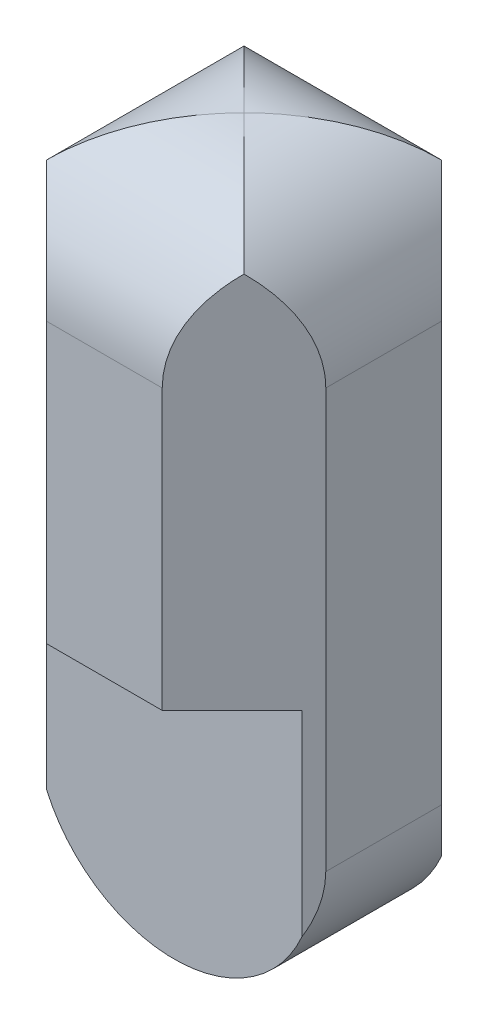
ISO-10303-21;
HEADER;
FILE_DESCRIPTION(('STEP AP214'),'2;1');
FILE_NAME('part.step','',(''),(''),'','','');
FILE_SCHEMA(('AUTOMOTIVE_DESIGN { 1 0 10303 214 1 1 1 1 }'));
ENDSEC;
DATA;
#1=APPLICATION_CONTEXT('core data for automotive mechanical design processes');
#2=APPLICATION_PROTOCOL_DEFINITION('international standard','automotive_design',2000,#1);
#3=PRODUCT_CONTEXT('',#1,'mechanical');
#4=PRODUCT('Part','Part','',(#3));
#5=PRODUCT_RELATED_PRODUCT_CATEGORY('part','',(#4));
#6=PRODUCT_DEFINITION_FORMATION('','',#4);
#7=PRODUCT_DEFINITION_CONTEXT('part definition',#1,'design');
#8=PRODUCT_DEFINITION('design','',#6,#7);
#9=PRODUCT_DEFINITION_SHAPE('','',#8);
#10=(LENGTH_UNIT() NAMED_UNIT(*) SI_UNIT(.MILLI.,.METRE.));
#11=(NAMED_UNIT(*) PLANE_ANGLE_UNIT() SI_UNIT($,.RADIAN.));
#12=(NAMED_UNIT(*) SI_UNIT($,.STERADIAN.) SOLID_ANGLE_UNIT());
#13=UNCERTAINTY_MEASURE_WITH_UNIT(LENGTH_MEASURE(1.E-05),#10,'distance_accuracy_value','');
#14=(GEOMETRIC_REPRESENTATION_CONTEXT(3) GLOBAL_UNCERTAINTY_ASSIGNED_CONTEXT((#13)) GLOBAL_UNIT_ASSIGNED_CONTEXT((#10,
#11,#12)) REPRESENTATION_CONTEXT('',''));
#15=CARTESIAN_POINT('',(0.,0.,0.));
#16=DIRECTION('',(0.,0.,1.));
#17=DIRECTION('',(1.,0.,0.));
#18=AXIS2_PLACEMENT_3D('',#15,#16,#17);
#19=CARTESIAN_POINT('',(4.14213562373094,50.,-10.));
#20=DIRECTION('',(0.,0.,1.));
#21=DIRECTION('',(1.,0.,0.));
#22=AXIS2_PLACEMENT_3D('',#19,#20,#21);
#23=PLANE('',#22);
#24=DIRECTION('',(1.,0.,0.));
#25=VECTOR('',#24,1.);
#26=CARTESIAN_POINT('',(-20.,40.,-9.99999999999999));
#27=LINE('',#26,#25);
#28=CARTESIAN_POINT('',(-4.14213562373095,40.,-10.));
#29=VERTEX_POINT('',#28);
#30=CARTESIAN_POINT('',(4.14213562373095,40.,-10.));
#31=VERTEX_POINT('',#30);
#32=EDGE_CURVE('E138',#29,#31,#27,.T.);
#33=ORIENTED_EDGE('',*,*,#32,.T.);
#34=DIRECTION('',(0.,-1.,0.));
#35=VECTOR('',#34,1.);
#36=CARTESIAN_POINT('',(4.14213562373094,50.,-10.));
#37=LINE('',#36,#35);
#38=CARTESIAN_POINT('',(4.14213562373094,20.,-10.));
#39=VERTEX_POINT('',#38);
#40=EDGE_CURVE('E163',#31,#39,#37,.T.);
#41=ORIENTED_EDGE('',*,*,#40,.T.);
#42=DIRECTION('',(1.,0.,0.));
#43=VECTOR('',#42,1.);
#44=CARTESIAN_POINT('',(10.,20.,-10.));
#45=LINE('',#44,#43);
#46=CARTESIAN_POINT('',(-4.14213562373096,20.,-10.));
#47=VERTEX_POINT('',#46);
#48=EDGE_CURVE('E162',#47,#39,#45,.T.);
#49=ORIENTED_EDGE('',*,*,#48,.F.);
#50=DIRECTION('',(0.,-1.,0.));
#51=VECTOR('',#50,1.);
#52=CARTESIAN_POINT('',(-4.14213562373096,50.,-10.));
#53=LINE('',#52,#51);
#54=EDGE_CURVE('E154',#29,#47,#53,.T.);
#55=ORIENTED_EDGE('',*,*,#54,.F.);
#56=EDGE_LOOP('',(#33,#41,#49,#55));
#57=FACE_BOUND('',#56,.T.);
#58=ADVANCED_FACE('F34',(#57),#23,.F.);
#59=CARTESIAN_POINT('',(0.,40.,-20.));
#60=DIRECTION('',(0.,0.,1.));
#61=DIRECTION('',(1.,0.,0.));
#62=AXIS2_PLACEMENT_3D('',#59,#60,#61);
#63=CYLINDRICAL_SURFACE('',#62,10.);
#64=CARTESIAN_POINT('',(0.,40.,-14.1421356237309));
#65=DIRECTION('',(-0.707106781186547,0.,0.707106781186548));
#66=DIRECTION('',(0.707106781186548,0.,0.707106781186547));
#67=AXIS2_PLACEMENT_3D('',#64,#65,#66);
#68=ELLIPSE('',#67,14.1421356237309,10.);
#69=CARTESIAN_POINT('',(7.07106781186547,47.0710678118655,-7.07106781186548));
#70=VERTEX_POINT('',#69);
#71=CARTESIAN_POINT('',(10.,40.,-4.14213562373095));
#72=VERTEX_POINT('',#71);
#73=EDGE_CURVE('E191',#70,#72,#68,.F.);
#74=ORIENTED_EDGE('',*,*,#73,.F.);
#75=CARTESIAN_POINT('',(0.,40.,0.));
#76=DIRECTION('',(0.707106781186548,0.,0.707106781186547));
#77=DIRECTION('',(-0.707106781186547,0.,0.707106781186548));
#78=AXIS2_PLACEMENT_3D('',#75,#76,#77);
#79=ELLIPSE('',#78,14.142135623731,10.);
#80=CARTESIAN_POINT('',(0.,50.,0.));
#81=VERTEX_POINT('',#80);
#82=EDGE_CURVE('E42',#70,#81,#79,.T.);
#83=ORIENTED_EDGE('',*,*,#82,.T.);
#84=CARTESIAN_POINT('',(0.,40.,0.));
#85=DIRECTION('',(-0.707106781186547,0.,0.707106781186548));
#86=DIRECTION('',(0.707106781186548,0.,0.707106781186547));
#87=AXIS2_PLACEMENT_3D('',#84,#85,#86);
#88=ELLIPSE('',#87,14.1421356237309,10.);
#89=CARTESIAN_POINT('',(7.07106781186548,47.0710678118655,7.07106781186547));
#90=VERTEX_POINT('',#89);
#91=EDGE_CURVE('E182',#81,#90,#88,.F.);
#92=ORIENTED_EDGE('',*,*,#91,.T.);
#93=CARTESIAN_POINT('',(0.,40.,14.1421356237309));
#94=DIRECTION('',(-0.707106781186548,0.,-0.707106781186548));
#95=DIRECTION('',(-0.707106781186548,0.,0.707106781186548));
#96=AXIS2_PLACEMENT_3D('',#93,#94,#95);
#97=ELLIPSE('',#96,14.1421356237309,10.);
#98=CARTESIAN_POINT('',(10.,40.,4.14213562373096));
#99=VERTEX_POINT('',#98);
#100=EDGE_CURVE('E215',#99,#90,#97,.F.);
#101=ORIENTED_EDGE('',*,*,#100,.F.);
#102=DIRECTION('',(0.,0.,1.));
#103=VECTOR('',#102,1.);
#104=CARTESIAN_POINT('',(10.,40.,-20.));
#105=LINE('',#104,#103);
#106=EDGE_CURVE('E206',#72,#99,#105,.T.);
#107=ORIENTED_EDGE('',*,*,#106,.F.);
#108=EDGE_LOOP('',(#74,#83,#92,#101,#107));
#109=FACE_BOUND('',#108,.T.);
#110=ADVANCED_FACE('F188',(#109),#63,.T.);
#111=CARTESIAN_POINT('',(-4.14213562373096,50.,10.));
#112=DIRECTION('',(0.,0.,-1.));
#113=DIRECTION('',(-1.,0.,0.));
#114=AXIS2_PLACEMENT_3D('',#111,#112,#113);
#115=PLANE('',#114);
#116=DIRECTION('',(0.,-1.,0.));
#117=VECTOR('',#116,1.);
#118=CARTESIAN_POINT('',(4.14213562373096,50.,10.));
#119=LINE('',#118,#117);
#120=CARTESIAN_POINT('',(4.14213562373095,40.,9.99999999999999));
#121=VERTEX_POINT('',#120);
#122=CARTESIAN_POINT('',(4.14213562373096,20.,10.));
#123=VERTEX_POINT('',#122);
#124=EDGE_CURVE('E261',#121,#123,#119,.T.);
#125=ORIENTED_EDGE('',*,*,#124,.F.);
#126=DIRECTION('',(1.,0.,0.));
#127=VECTOR('',#126,1.);
#128=CARTESIAN_POINT('',(-20.,40.,10.));
#129=LINE('',#128,#127);
#130=CARTESIAN_POINT('',(-4.14213562373096,40.,10.));
#131=VERTEX_POINT('',#130);
#132=EDGE_CURVE('E148',#131,#121,#129,.T.);
#133=ORIENTED_EDGE('',*,*,#132,.F.);
#134=DIRECTION('',(0.,-1.,0.));
#135=VECTOR('',#134,1.);
#136=CARTESIAN_POINT('',(-4.14213562373096,50.,10.));
#137=LINE('',#136,#135);
#138=CARTESIAN_POINT('',(-4.14213562373096,20.,10.));
#139=VERTEX_POINT('',#138);
#140=EDGE_CURVE('E204',#131,#139,#137,.T.);
#141=ORIENTED_EDGE('',*,*,#140,.T.);
#142=DIRECTION('',(-1.,0.,0.));
#143=VECTOR('',#142,1.);
#144=CARTESIAN_POINT('',(-10.,20.,10.));
#145=LINE('',#144,#143);
#146=EDGE_CURVE('E229',#123,#139,#145,.T.);
#147=ORIENTED_EDGE('',*,*,#146,.F.);
#148=EDGE_LOOP('',(#125,#133,#141,#147));
#149=FACE_BOUND('',#148,.T.);
#150=ADVANCED_FACE('F295',(#149),#115,.F.);
#151=CARTESIAN_POINT('',(10.,50.,4.14213562373095));
#152=DIRECTION('',(-1.,0.,0.));
#153=DIRECTION('',(0.,0.,1.));
#154=AXIS2_PLACEMENT_3D('',#151,#152,#153);
#155=PLANE('',#154);
#156=ORIENTED_EDGE('',*,*,#106,.T.);
#157=DIRECTION('',(0.,-1.,0.));
#158=VECTOR('',#157,1.);
#159=CARTESIAN_POINT('',(10.,50.,4.14213562373095));
#160=LINE('',#159,#158);
#161=CARTESIAN_POINT('',(10.,9.99999999999999,4.14213562373095));
#162=VERTEX_POINT('',#161);
#163=EDGE_CURVE('E259',#99,#162,#160,.T.);
#164=ORIENTED_EDGE('',*,*,#163,.T.);
#165=DIRECTION('',(0.,0.,1.));
#166=VECTOR('',#165,1.);
#167=CARTESIAN_POINT('',(10.,10.,-56.));
#168=LINE('',#167,#166);
#169=CARTESIAN_POINT('',(10.,10.,-4.14213562373095));
#170=VERTEX_POINT('',#169);
#171=EDGE_CURVE('E242',#170,#162,#168,.T.);
#172=ORIENTED_EDGE('',*,*,#171,.F.);
#173=DIRECTION('',(0.,-1.,0.));
#174=VECTOR('',#173,1.);
#175=CARTESIAN_POINT('',(10.,50.,-4.14213562373095));
#176=LINE('',#175,#174);
#177=EDGE_CURVE('E166',#72,#170,#176,.T.);
#178=ORIENTED_EDGE('',*,*,#177,.F.);
#179=EDGE_LOOP('',(#156,#164,#172,#178));
#180=FACE_BOUND('',#179,.T.);
#181=ADVANCED_FACE('F36',(#180),#155,.F.);
#182=CARTESIAN_POINT('',(0.,10.,-56.));
#183=DIRECTION('',(0.,0.,1.));
#184=DIRECTION('',(1.,0.,0.));
#185=AXIS2_PLACEMENT_3D('',#182,#183,#184);
#186=CYLINDRICAL_SURFACE('',#185,10.);
#187=CARTESIAN_POINT('',(0.,10.,-5.));
#188=DIRECTION('',(0.,0.,-1.));
#189=DIRECTION('',(-1.,0.,0.));
#190=AXIS2_PLACEMENT_3D('',#187,#188,#189);
#191=CIRCLE('',#190,10.);
#192=CARTESIAN_POINT('',(9.14213562373095,5.94767273812816,-5.00000000000001));
#193=VERTEX_POINT('',#192);
#194=CARTESIAN_POINT('',(-9.14213562373095,5.94767273812821,-5.));
#195=VERTEX_POINT('',#194);
#196=EDGE_CURVE('E57',#193,#195,#191,.T.);
#197=ORIENTED_EDGE('',*,*,#196,.F.);
#198=CARTESIAN_POINT('',(0.,10.,-14.1421356237309));
#199=DIRECTION('',(-0.707106781186547,0.,0.707106781186548));
#200=DIRECTION('',(0.707106781186548,0.,0.707106781186547));
#201=AXIS2_PLACEMENT_3D('',#198,#199,#200);
#202=ELLIPSE('',#201,14.1421356237309,10.);
#203=EDGE_CURVE('E256',#170,#193,#202,.F.);
#204=ORIENTED_EDGE('',*,*,#203,.F.);
#205=ORIENTED_EDGE('',*,*,#171,.T.);
#206=CARTESIAN_POINT('',(0.,10.,14.1421356237309));
#207=DIRECTION('',(-0.707106781186548,0.,-0.707106781186548));
#208=DIRECTION('',(-0.707106781186548,0.,0.707106781186548));
#209=AXIS2_PLACEMENT_3D('',#206,#207,#208);
#210=ELLIPSE('',#209,14.1421356237309,10.);
#211=CARTESIAN_POINT('',(9.14213562373095,5.94767273812817,5.));
#212=VERTEX_POINT('',#211);
#213=EDGE_CURVE('E250',#212,#162,#210,.F.);
#214=ORIENTED_EDGE('',*,*,#213,.F.);
#215=CARTESIAN_POINT('',(0.,10.,5.));
#216=DIRECTION('',(0.,0.,1.));
#217=DIRECTION('',(1.,0.,0.));
#218=AXIS2_PLACEMENT_3D('',#215,#216,#217);
#219=CIRCLE('',#218,10.);
#220=CARTESIAN_POINT('',(-9.14213562373095,5.94767273812819,5.00000000000001));
#221=VERTEX_POINT('',#220);
#222=EDGE_CURVE('E173',#221,#212,#219,.T.);
#223=ORIENTED_EDGE('',*,*,#222,.F.);
#224=CARTESIAN_POINT('',(0.,10.,14.142135623731));
#225=DIRECTION('',(0.707106781186548,0.,-0.707106781186547));
#226=DIRECTION('',(0.707106781186547,0.,0.707106781186548));
#227=AXIS2_PLACEMENT_3D('',#224,#225,#226);
#228=ELLIPSE('',#227,14.142135623731,10.);
#229=CARTESIAN_POINT('',(-10.,10.,4.14213562373096));
#230=VERTEX_POINT('',#229);
#231=EDGE_CURVE('E253',#230,#221,#228,.F.);
#232=ORIENTED_EDGE('',*,*,#231,.F.);
#233=DIRECTION('',(0.,0.,1.));
#234=VECTOR('',#233,1.);
#235=CARTESIAN_POINT('',(-10.,10.,-56.));
#236=LINE('',#235,#234);
#237=CARTESIAN_POINT('',(-10.,10.,-4.14213562373095));
#238=VERTEX_POINT('',#237);
#239=EDGE_CURVE('E241',#238,#230,#236,.T.);
#240=ORIENTED_EDGE('',*,*,#239,.F.);
#241=CARTESIAN_POINT('',(0.,10.,-14.142135623731));
#242=DIRECTION('',(0.707106781186548,0.,0.707106781186547));
#243=DIRECTION('',(-0.707106781186547,0.,0.707106781186548));
#244=AXIS2_PLACEMENT_3D('',#241,#242,#243);
#245=ELLIPSE('',#244,14.142135623731,10.);
#246=EDGE_CURVE('E245',#195,#238,#245,.F.);
#247=ORIENTED_EDGE('',*,*,#246,.F.);
#248=EDGE_LOOP('',(#197,#204,#205,#214,#223,#232,#240,#247));
#249=FACE_BOUND('',#248,.T.);
#250=ADVANCED_FACE('F271',(#249),#186,.T.);
#251=CARTESIAN_POINT('',(-10.,50.,-4.14213562373095));
#252=DIRECTION('',(1.,0.,0.));
#253=DIRECTION('',(0.,0.,-1.));
#254=AXIS2_PLACEMENT_3D('',#251,#252,#253);
#255=PLANE('',#254);
#256=DIRECTION('',(0.,-1.,0.));
#257=VECTOR('',#256,1.);
#258=CARTESIAN_POINT('',(-10.,50.,4.14213562373096));
#259=LINE('',#258,#257);
#260=CARTESIAN_POINT('',(-10.,40.,4.14213562373096));
#261=VERTEX_POINT('',#260);
#262=EDGE_CURVE('E168',#261,#230,#259,.T.);
#263=ORIENTED_EDGE('',*,*,#262,.F.);
#264=DIRECTION('',(0.,0.,1.));
#265=VECTOR('',#264,1.);
#266=CARTESIAN_POINT('',(-10.,40.,-20.));
#267=LINE('',#266,#265);
#268=CARTESIAN_POINT('',(-10.,40.,-4.14213562373095));
#269=VERTEX_POINT('',#268);
#270=EDGE_CURVE('E210',#269,#261,#267,.T.);
#271=ORIENTED_EDGE('',*,*,#270,.F.);
#272=DIRECTION('',(0.,-1.,0.));
#273=VECTOR('',#272,1.);
#274=CARTESIAN_POINT('',(-10.,50.,-4.14213562373095));
#275=LINE('',#274,#273);
#276=EDGE_CURVE('E164',#269,#238,#275,.T.);
#277=ORIENTED_EDGE('',*,*,#276,.T.);
#278=ORIENTED_EDGE('',*,*,#239,.T.);
#279=EDGE_LOOP('',(#263,#271,#277,#278));
#280=FACE_BOUND('',#279,.T.);
#281=ADVANCED_FACE('F274',(#280),#255,.F.);
#282=CARTESIAN_POINT('',(10.,50.,-4.14213562373095));
#283=DIRECTION('',(-0.707106781186547,0.,0.707106781186548));
#284=DIRECTION('',(0.707106781186548,0.,0.707106781186547));
#285=AXIS2_PLACEMENT_3D('',#282,#283,#284);
#286=PLANE('',#285);
#287=ORIENTED_EDGE('',*,*,#40,.F.);
#288=CARTESIAN_POINT('',(14.1421356237309,40.,0.));
#289=DIRECTION('',(-0.707106781186547,0.,0.707106781186548));
#290=DIRECTION('',(0.707106781186548,0.,0.707106781186547));
#291=AXIS2_PLACEMENT_3D('',#288,#289,#290);
#292=ELLIPSE('',#291,14.1421356237309,10.);
#293=EDGE_CURVE('E144',#31,#70,#292,.F.);
#294=ORIENTED_EDGE('',*,*,#293,.T.);
#295=ORIENTED_EDGE('',*,*,#73,.T.);
#296=ORIENTED_EDGE('',*,*,#177,.T.);
#297=ORIENTED_EDGE('',*,*,#203,.T.);
#298=DIRECTION('',(0.,-1.,0.));
#299=VECTOR('',#298,1.);
#300=CARTESIAN_POINT('',(9.14213562373095,50.,-5.00000000000001));
#301=LINE('',#300,#299);
#302=CARTESIAN_POINT('',(9.14213562373095,20.,-5.00000000000001));
#303=VERTEX_POINT('',#302);
#304=EDGE_CURVE('E223',#303,#193,#301,.T.);
#305=ORIENTED_EDGE('',*,*,#304,.F.);
#306=DIRECTION('',(-0.707106781186548,0.,-0.707106781186547));
#307=VECTOR('',#306,1.);
#308=CARTESIAN_POINT('',(10.,20.,-4.14213562373095));
#309=LINE('',#308,#307);
#310=EDGE_CURVE('E226',#303,#39,#309,.T.);
#311=ORIENTED_EDGE('',*,*,#310,.T.);
#312=EDGE_LOOP('',(#287,#294,#295,#296,#297,#305,#311));
#313=FACE_BOUND('',#312,.T.);
#314=ADVANCED_FACE('F279',(#313),#286,.F.);
#315=CARTESIAN_POINT('',(-4.14213562373096,50.,-10.));
#316=DIRECTION('',(0.707106781186548,0.,0.707106781186547));
#317=DIRECTION('',(0.707106781186547,0.,-0.707106781186548));
#318=AXIS2_PLACEMENT_3D('',#315,#316,#317);
#319=PLANE('',#318);
#320=CARTESIAN_POINT('',(0.,40.,-14.142135623731));
#321=DIRECTION('',(0.707106781186548,0.,0.707106781186547));
#322=DIRECTION('',(-0.707106781186547,0.,0.707106781186548));
#323=AXIS2_PLACEMENT_3D('',#320,#321,#322);
#324=ELLIPSE('',#323,14.142135623731,10.);
#325=CARTESIAN_POINT('',(-7.07106781186548,47.0710678118655,-7.07106781186548));
#326=VERTEX_POINT('',#325);
#327=EDGE_CURVE('E157',#269,#326,#324,.F.);
#328=ORIENTED_EDGE('',*,*,#327,.T.);
#329=CARTESIAN_POINT('',(-14.142135623731,40.,0.));
#330=DIRECTION('',(0.707106781186548,0.,0.707106781186547));
#331=DIRECTION('',(0.707106781186547,0.,-0.707106781186548));
#332=AXIS2_PLACEMENT_3D('',#329,#330,#331);
#333=ELLIPSE('',#332,14.142135623731,10.);
#334=EDGE_CURVE('E141',#326,#29,#333,.F.);
#335=ORIENTED_EDGE('',*,*,#334,.T.);
#336=ORIENTED_EDGE('',*,*,#54,.T.);
#337=DIRECTION('',(-0.707106781186547,0.,0.707106781186548));
#338=VECTOR('',#337,1.);
#339=CARTESIAN_POINT('',(-4.14213562373096,20.,-10.));
#340=LINE('',#339,#338);
#341=CARTESIAN_POINT('',(-9.14213562373096,20.,-5.));
#342=VERTEX_POINT('',#341);
#343=EDGE_CURVE('E180',#47,#342,#340,.T.);
#344=ORIENTED_EDGE('',*,*,#343,.T.);
#345=DIRECTION('',(0.,1.,0.));
#346=VECTOR('',#345,1.);
#347=CARTESIAN_POINT('',(-9.14213562373095,50.,-5.));
#348=LINE('',#347,#346);
#349=EDGE_CURVE('E178',#195,#342,#348,.T.);
#350=ORIENTED_EDGE('',*,*,#349,.F.);
#351=ORIENTED_EDGE('',*,*,#246,.T.);
#352=ORIENTED_EDGE('',*,*,#276,.F.);
#353=EDGE_LOOP('',(#328,#335,#336,#344,#350,#351,#352));
#354=FACE_BOUND('',#353,.T.);
#355=ADVANCED_FACE('F152',(#354),#319,.F.);
#356=CARTESIAN_POINT('',(-10.,50.,4.14213562373096));
#357=DIRECTION('',(0.707106781186548,0.,-0.707106781186547));
#358=DIRECTION('',(-0.707106781186547,0.,-0.707106781186548));
#359=AXIS2_PLACEMENT_3D('',#356,#357,#358);
#360=PLANE('',#359);
#361=ORIENTED_EDGE('',*,*,#140,.F.);
#362=CARTESIAN_POINT('',(-14.1421356237309,40.,0.));
#363=DIRECTION('',(0.707106781186548,0.,-0.707106781186547));
#364=DIRECTION('',(0.707106781186547,0.,0.707106781186548));
#365=AXIS2_PLACEMENT_3D('',#362,#363,#364);
#366=ELLIPSE('',#365,14.1421356237309,10.);
#367=CARTESIAN_POINT('',(-7.07106781186548,47.0710678118655,7.07106781186548));
#368=VERTEX_POINT('',#367);
#369=EDGE_CURVE('E158',#131,#368,#366,.F.);
#370=ORIENTED_EDGE('',*,*,#369,.T.);
#371=CARTESIAN_POINT('',(0.,40.,14.142135623731));
#372=DIRECTION('',(0.707106781186548,0.,-0.707106781186547));
#373=DIRECTION('',(0.707106781186547,0.,0.707106781186548));
#374=AXIS2_PLACEMENT_3D('',#371,#372,#373);
#375=ELLIPSE('',#374,14.142135623731,10.);
#376=EDGE_CURVE('E196',#368,#261,#375,.F.);
#377=ORIENTED_EDGE('',*,*,#376,.T.);
#378=ORIENTED_EDGE('',*,*,#262,.T.);
#379=ORIENTED_EDGE('',*,*,#231,.T.);
#380=DIRECTION('',(0.,-1.,0.));
#381=VECTOR('',#380,1.);
#382=CARTESIAN_POINT('',(-9.14213562373095,50.,5.));
#383=LINE('',#382,#381);
#384=CARTESIAN_POINT('',(-9.14213562373095,20.,5.));
#385=VERTEX_POINT('',#384);
#386=EDGE_CURVE('E237',#385,#221,#383,.T.);
#387=ORIENTED_EDGE('',*,*,#386,.F.);
#388=DIRECTION('',(0.707106781186547,0.,0.707106781186548));
#389=VECTOR('',#388,1.);
#390=CARTESIAN_POINT('',(-10.,20.,4.14213562373096));
#391=LINE('',#390,#389);
#392=EDGE_CURVE('E239',#385,#139,#391,.T.);
#393=ORIENTED_EDGE('',*,*,#392,.T.);
#394=EDGE_LOOP('',(#361,#370,#377,#378,#379,#387,#393));
#395=FACE_BOUND('',#394,.T.);
#396=ADVANCED_FACE('F202',(#395),#360,.F.);
#397=CARTESIAN_POINT('',(4.14213562373096,50.,10.));
#398=DIRECTION('',(-0.707106781186548,0.,-0.707106781186548));
#399=DIRECTION('',(-0.707106781186548,0.,0.707106781186548));
#400=AXIS2_PLACEMENT_3D('',#397,#398,#399);
#401=PLANE('',#400);
#402=ORIENTED_EDGE('',*,*,#100,.T.);
#403=CARTESIAN_POINT('',(14.142135623731,40.,0.));
#404=DIRECTION('',(-0.707106781186548,0.,-0.707106781186548));
#405=DIRECTION('',(0.707106781186548,0.,-0.707106781186548));
#406=AXIS2_PLACEMENT_3D('',#403,#404,#405);
#407=ELLIPSE('',#406,14.142135623731,10.);
#408=EDGE_CURVE('E49',#90,#121,#407,.F.);
#409=ORIENTED_EDGE('',*,*,#408,.T.);
#410=ORIENTED_EDGE('',*,*,#124,.T.);
#411=DIRECTION('',(0.707106781186548,0.,-0.707106781186548));
#412=VECTOR('',#411,1.);
#413=CARTESIAN_POINT('',(4.14213562373096,20.,10.));
#414=LINE('',#413,#412);
#415=CARTESIAN_POINT('',(9.14213562373096,20.,5.));
#416=VERTEX_POINT('',#415);
#417=EDGE_CURVE('E175',#123,#416,#414,.T.);
#418=ORIENTED_EDGE('',*,*,#417,.T.);
#419=DIRECTION('',(0.,1.,0.));
#420=VECTOR('',#419,1.);
#421=CARTESIAN_POINT('',(9.14213562373095,50.,5.));
#422=LINE('',#421,#420);
#423=EDGE_CURVE('E233',#212,#416,#422,.T.);
#424=ORIENTED_EDGE('',*,*,#423,.F.);
#425=ORIENTED_EDGE('',*,*,#213,.T.);
#426=ORIENTED_EDGE('',*,*,#163,.F.);
#427=EDGE_LOOP('',(#402,#409,#410,#418,#424,#425,#426));
#428=FACE_BOUND('',#427,.T.);
#429=ADVANCED_FACE('F285',(#428),#401,.F.);
#430=CARTESIAN_POINT('',(-10.,20.,5.));
#431=DIRECTION('',(0.,1.,0.));
#432=DIRECTION('',(0.,0.,1.));
#433=AXIS2_PLACEMENT_3D('',#430,#431,#432);
#434=PLANE('',#433);
#435=DIRECTION('',(-1.,0.,0.));
#436=VECTOR('',#435,1.);
#437=CARTESIAN_POINT('',(-10.,20.,5.));
#438=LINE('',#437,#436);
#439=EDGE_CURVE('E230',#416,#385,#438,.T.);
#440=ORIENTED_EDGE('',*,*,#439,.F.);
#441=ORIENTED_EDGE('',*,*,#417,.F.);
#442=ORIENTED_EDGE('',*,*,#146,.T.);
#443=ORIENTED_EDGE('',*,*,#392,.F.);
#444=EDGE_LOOP('',(#440,#441,#442,#443));
#445=FACE_BOUND('',#444,.T.);
#446=ADVANCED_FACE('F291',(#445),#434,.F.);
#447=CARTESIAN_POINT('',(0.,10.,5.));
#448=DIRECTION('',(0.,0.,1.));
#449=DIRECTION('',(1.,0.,0.));
#450=AXIS2_PLACEMENT_3D('',#447,#448,#449);
#451=PLANE('',#450);
#452=ORIENTED_EDGE('',*,*,#386,.T.);
#453=ORIENTED_EDGE('',*,*,#222,.T.);
#454=ORIENTED_EDGE('',*,*,#423,.T.);
#455=ORIENTED_EDGE('',*,*,#439,.T.);
#456=EDGE_LOOP('',(#452,#453,#454,#455));
#457=FACE_BOUND('',#456,.T.);
#458=ADVANCED_FACE('F289',(#457),#451,.T.);
#459=CARTESIAN_POINT('',(10.,20.,-5.00000000000001));
#460=DIRECTION('',(0.,1.,0.));
#461=DIRECTION('',(0.,0.,1.));
#462=AXIS2_PLACEMENT_3D('',#459,#460,#461);
#463=PLANE('',#462);
#464=DIRECTION('',(1.,0.,0.));
#465=VECTOR('',#464,1.);
#466=CARTESIAN_POINT('',(10.,20.,-5.00000000000001));
#467=LINE('',#466,#465);
#468=EDGE_CURVE('E220',#342,#303,#467,.T.);
#469=ORIENTED_EDGE('',*,*,#468,.F.);
#470=ORIENTED_EDGE('',*,*,#343,.F.);
#471=ORIENTED_EDGE('',*,*,#48,.T.);
#472=ORIENTED_EDGE('',*,*,#310,.F.);
#473=EDGE_LOOP('',(#469,#470,#471,#472));
#474=FACE_BOUND('',#473,.T.);
#475=ADVANCED_FACE('F332',(#474),#463,.F.);
#476=CARTESIAN_POINT('',(0.,10.,-5.));
#477=DIRECTION('',(0.,0.,-1.));
#478=DIRECTION('',(-1.,0.,0.));
#479=AXIS2_PLACEMENT_3D('',#476,#477,#478);
#480=PLANE('',#479);
#481=ORIENTED_EDGE('',*,*,#304,.T.);
#482=ORIENTED_EDGE('',*,*,#196,.T.);
#483=ORIENTED_EDGE('',*,*,#349,.T.);
#484=ORIENTED_EDGE('',*,*,#468,.T.);
#485=EDGE_LOOP('',(#481,#482,#483,#484));
#486=FACE_BOUND('',#485,.T.);
#487=ADVANCED_FACE('F335',(#486),#480,.T.);
#488=ORIENTED_EDGE('',*,*,#376,.F.);
#489=CARTESIAN_POINT('',(0.,40.,0.));
#490=DIRECTION('',(0.707106781186548,0.,0.707106781186547));
#491=DIRECTION('',(-0.707106781186547,0.,0.707106781186548));
#492=AXIS2_PLACEMENT_3D('',#489,#490,#491);
#493=ELLIPSE('',#492,14.142135623731,10.);
#494=EDGE_CURVE('E11',#368,#81,#493,.F.);
#495=ORIENTED_EDGE('',*,*,#494,.T.);
#496=CARTESIAN_POINT('',(0.,40.,0.));
#497=DIRECTION('',(-0.707106781186547,0.,0.707106781186548));
#498=DIRECTION('',(0.707106781186548,0.,0.707106781186547));
#499=AXIS2_PLACEMENT_3D('',#496,#497,#498);
#500=ELLIPSE('',#499,14.1421356237309,10.);
#501=EDGE_CURVE('E184',#81,#326,#500,.T.);
#502=ORIENTED_EDGE('',*,*,#501,.T.);
#503=ORIENTED_EDGE('',*,*,#327,.F.);
#504=ORIENTED_EDGE('',*,*,#270,.T.);
#505=EDGE_LOOP('',(#488,#495,#502,#503,#504));
#506=FACE_BOUND('',#505,.T.);
#507=ADVANCED_FACE('F194',(#506),#63,.T.);
#508=CARTESIAN_POINT('',(-20.,40.,0.));
#509=DIRECTION('',(1.,0.,0.));
#510=DIRECTION('',(0.,0.,-1.));
#511=AXIS2_PLACEMENT_3D('',#508,#509,#510);
#512=CYLINDRICAL_SURFACE('',#511,10.);
#513=ORIENTED_EDGE('',*,*,#132,.T.);
#514=ORIENTED_EDGE('',*,*,#408,.F.);
#515=ORIENTED_EDGE('',*,*,#91,.F.);
#516=ORIENTED_EDGE('',*,*,#494,.F.);
#517=ORIENTED_EDGE('',*,*,#369,.F.);
#518=EDGE_LOOP('',(#513,#514,#515,#516,#517));
#519=FACE_BOUND('',#518,.T.);
#520=ADVANCED_FACE('F198',(#519),#512,.T.);
#521=ORIENTED_EDGE('',*,*,#32,.F.);
#522=ORIENTED_EDGE('',*,*,#334,.F.);
#523=ORIENTED_EDGE('',*,*,#501,.F.);
#524=ORIENTED_EDGE('',*,*,#82,.F.);
#525=ORIENTED_EDGE('',*,*,#293,.F.);
#526=EDGE_LOOP('',(#521,#522,#523,#524,#525));
#527=FACE_BOUND('',#526,.T.);
#528=ADVANCED_FACE('F140',(#527),#512,.T.);
#529=CLOSED_SHELL('',(#58,#110,#150,#181,#250,#281,#314,#355,#396,#429,#446,#458,#475,#487,#507,
#520,#528));
#530=MANIFOLD_SOLID_BREP('B2',#529);
#531=ADVANCED_BREP_SHAPE_REPRESENTATION('',(#18,#530),#14);
#532=SHAPE_DEFINITION_REPRESENTATION(#9,#531);
ENDSEC;
END-ISO-10303-21;
